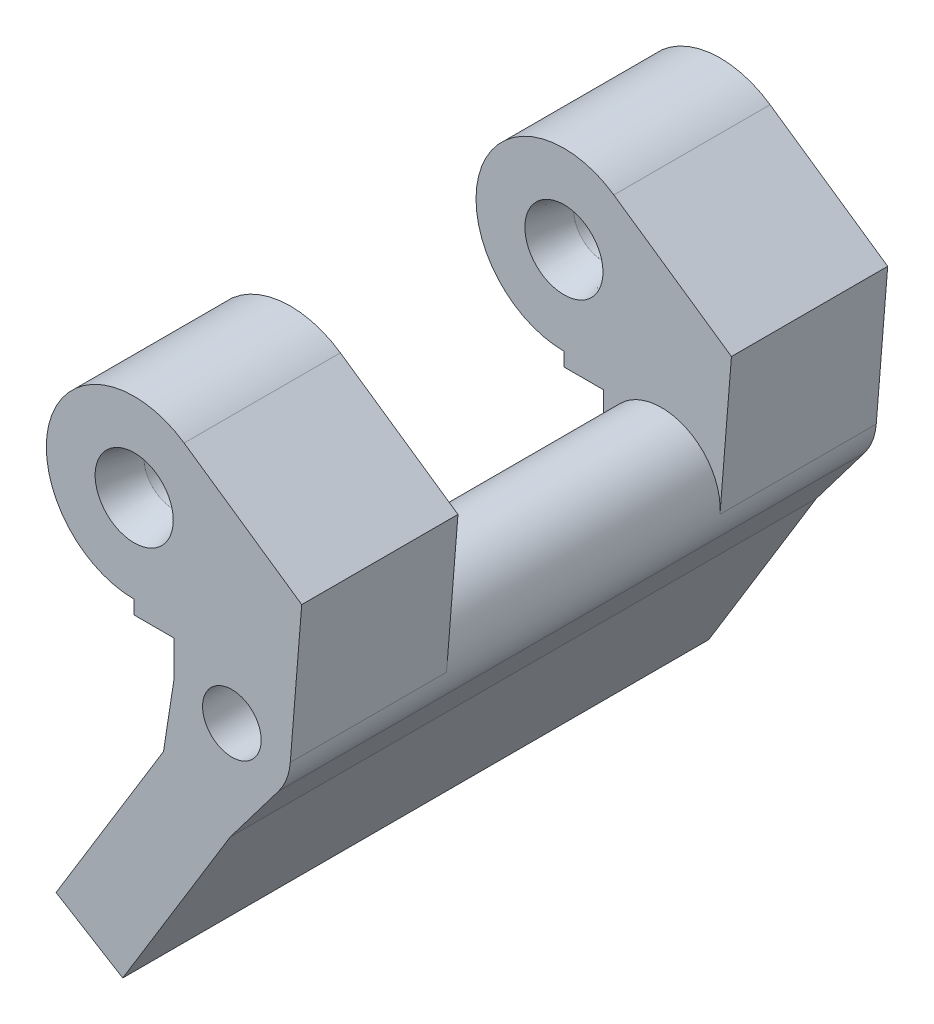
ISO-10303-21;
HEADER;
FILE_DESCRIPTION(('STEP AP214'),'2;1');
FILE_NAME('part.step','',(''),(''),'','','');
FILE_SCHEMA(('AUTOMOTIVE_DESIGN { 1 0 10303 214 1 1 1 1 }'));
ENDSEC;
DATA;
#1=APPLICATION_CONTEXT('core data for automotive mechanical design processes');
#2=APPLICATION_PROTOCOL_DEFINITION('international standard','automotive_design',2000,#1);
#3=PRODUCT_CONTEXT('',#1,'mechanical');
#4=PRODUCT('Part','Part','',(#3));
#5=PRODUCT_RELATED_PRODUCT_CATEGORY('part','',(#4));
#6=PRODUCT_DEFINITION_FORMATION('','',#4);
#7=PRODUCT_DEFINITION_CONTEXT('part definition',#1,'design');
#8=PRODUCT_DEFINITION('design','',#6,#7);
#9=PRODUCT_DEFINITION_SHAPE('','',#8);
#10=(LENGTH_UNIT() NAMED_UNIT(*) SI_UNIT(.MILLI.,.METRE.));
#11=(NAMED_UNIT(*) PLANE_ANGLE_UNIT() SI_UNIT($,.RADIAN.));
#12=(NAMED_UNIT(*) SI_UNIT($,.STERADIAN.) SOLID_ANGLE_UNIT());
#13=UNCERTAINTY_MEASURE_WITH_UNIT(LENGTH_MEASURE(1.E-05),#10,'distance_accuracy_value','');
#14=(GEOMETRIC_REPRESENTATION_CONTEXT(3) GLOBAL_UNCERTAINTY_ASSIGNED_CONTEXT((#13)) GLOBAL_UNIT_ASSIGNED_CONTEXT((#10,
#11,#12)) REPRESENTATION_CONTEXT('',''));
#15=CARTESIAN_POINT('',(0.,0.,0.));
#16=DIRECTION('',(0.,0.,1.));
#17=DIRECTION('',(1.,0.,0.));
#18=AXIS2_PLACEMENT_3D('',#15,#16,#17);
#19=CARTESIAN_POINT('',(25.8780535911808,-15.8143660834993,-30.));
#20=DIRECTION('',(-0.853281833651959,0.521450009453975,0.));
#21=DIRECTION('',(-0.521450009453975,-0.853281833651959,0.));
#22=AXIS2_PLACEMENT_3D('',#19,#20,#21);
#23=PLANE('',#22);
#24=DIRECTION('',(-0.521450009453975,-0.853281833651959,0.));
#25=VECTOR('',#24,1.);
#26=CARTESIAN_POINT('',(25.8780535911808,-15.8143660834993,0.));
#27=LINE('',#26,#25);
#28=CARTESIAN_POINT('',(25.4131273346078,-16.5751545033459,0.));
#29=VERTEX_POINT('',#28);
#30=CARTESIAN_POINT('',(19.9131273346078,-25.5751545033459,0.));
#31=VERTEX_POINT('',#30);
#32=EDGE_CURVE('E275',#29,#31,#27,.T.);
#33=ORIENTED_EDGE('',*,*,#32,.T.);
#34=DIRECTION('',(0.,0.,1.));
#35=VECTOR('',#34,1.);
#36=CARTESIAN_POINT('',(19.9131273346078,-25.5751545033459,-30.));
#37=LINE('',#36,#35);
#38=CARTESIAN_POINT('',(19.9131273346078,-25.5751545033459,-30.));
#39=VERTEX_POINT('',#38);
#40=EDGE_CURVE('E329',#39,#31,#37,.T.);
#41=ORIENTED_EDGE('',*,*,#40,.F.);
#42=DIRECTION('',(-0.521450009453975,-0.853281833651959,0.));
#43=VECTOR('',#42,1.);
#44=CARTESIAN_POINT('',(25.8780535911808,-15.8143660834993,-30.));
#45=LINE('',#44,#43);
#46=CARTESIAN_POINT('',(25.4131273346078,-16.5751545033459,-30.));
#47=VERTEX_POINT('',#46);
#48=EDGE_CURVE('E289',#47,#39,#45,.T.);
#49=ORIENTED_EDGE('',*,*,#48,.F.);
#50=DIRECTION('',(0.,0.,1.));
#51=VECTOR('',#50,1.);
#52=CARTESIAN_POINT('',(25.4131273346078,-16.5751545033459,-30.));
#53=LINE('',#52,#51);
#54=EDGE_CURVE('E309',#47,#29,#53,.T.);
#55=ORIENTED_EDGE('',*,*,#54,.T.);
#56=EDGE_LOOP('',(#33,#41,#49,#55));
#57=FACE_BOUND('',#56,.T.);
#58=ADVANCED_FACE('F45',(#57),#23,.F.);
#59=CARTESIAN_POINT('',(-5.96492625657291,-9.76078841984659,-30.));
#60=DIRECTION('',(-0.521450009453975,-0.853281833651959,0.));
#61=DIRECTION('',(0.853281833651959,-0.521450009453975,0.));
#62=AXIS2_PLACEMENT_3D('',#59,#60,#61);
#63=PLANE('',#62);
#64=DIRECTION('',(0.853281833651959,-0.521450009453975,0.));
#65=VECTOR('',#64,1.);
#66=CARTESIAN_POINT('',(-5.96492625657291,-9.76078841984659,0.));
#67=LINE('',#66,#65);
#68=CARTESIAN_POINT('',(16.5,-23.48935446553,0.));
#69=VERTEX_POINT('',#68);
#70=EDGE_CURVE('E324',#69,#31,#67,.T.);
#71=ORIENTED_EDGE('',*,*,#70,.F.);
#72=DIRECTION('',(0.,0.,1.));
#73=VECTOR('',#72,1.);
#74=CARTESIAN_POINT('',(16.5,-23.48935446553,-30.));
#75=LINE('',#74,#73);
#76=CARTESIAN_POINT('',(16.5,-23.48935446553,-30.));
#77=VERTEX_POINT('',#76);
#78=EDGE_CURVE('E332',#77,#69,#75,.T.);
#79=ORIENTED_EDGE('',*,*,#78,.F.);
#80=DIRECTION('',(0.853281833651959,-0.521450009453975,0.));
#81=VECTOR('',#80,1.);
#82=CARTESIAN_POINT('',(-5.96492625657291,-9.76078841984659,-30.));
#83=LINE('',#82,#81);
#84=EDGE_CURVE('E303',#77,#39,#83,.T.);
#85=ORIENTED_EDGE('',*,*,#84,.T.);
#86=ORIENTED_EDGE('',*,*,#40,.T.);
#87=EDGE_LOOP('',(#71,#79,#85,#86));
#88=FACE_BOUND('',#87,.T.);
#89=ADVANCED_FACE('F373',(#88),#63,.T.);
#90=CARTESIAN_POINT('',(22.4649262565729,-13.7285660456834,-30.));
#91=DIRECTION('',(-0.853281833651959,0.521450009453975,0.));
#92=DIRECTION('',(-0.521450009453975,-0.853281833651959,0.));
#93=AXIS2_PLACEMENT_3D('',#90,#91,#92);
#94=PLANE('',#93);
#95=DIRECTION('',(-0.521450009453975,-0.853281833651959,0.));
#96=VECTOR('',#95,1.);
#97=CARTESIAN_POINT('',(22.4649262565729,-13.7285660456834,0.));
#98=LINE('',#97,#96);
#99=CARTESIAN_POINT('',(22.,-14.48935446553,0.));
#100=VERTEX_POINT('',#99);
#101=EDGE_CURVE('E321',#100,#69,#98,.T.);
#102=ORIENTED_EDGE('',*,*,#101,.F.);
#103=DIRECTION('',(0.,0.,1.));
#104=VECTOR('',#103,1.);
#105=CARTESIAN_POINT('',(22.,-14.48935446553,-30.));
#106=LINE('',#105,#104);
#107=CARTESIAN_POINT('',(22.,-14.48935446553,-30.));
#108=VERTEX_POINT('',#107);
#109=EDGE_CURVE('E334',#108,#100,#106,.T.);
#110=ORIENTED_EDGE('',*,*,#109,.F.);
#111=DIRECTION('',(-0.521450009453975,-0.853281833651959,0.));
#112=VECTOR('',#111,1.);
#113=CARTESIAN_POINT('',(22.4649262565729,-13.7285660456834,-30.));
#114=LINE('',#113,#112);
#115=EDGE_CURVE('E300',#108,#77,#114,.T.);
#116=ORIENTED_EDGE('',*,*,#115,.T.);
#117=ORIENTED_EDGE('',*,*,#78,.T.);
#118=EDGE_LOOP('',(#102,#110,#116,#117));
#119=FACE_BOUND('',#118,.T.);
#120=ADVANCED_FACE('F379',(#119),#94,.T.);
#121=CARTESIAN_POINT('',(23.6753460313299,-3.66404164770582,-30.));
#122=DIRECTION('',(-0.988235294117647,0.152941176470588,0.));
#123=DIRECTION('',(-0.152941176470588,-0.988235294117647,0.));
#124=AXIS2_PLACEMENT_3D('',#121,#122,#123);
#125=PLANE('',#124);
#126=DIRECTION('',(-0.152941176470588,-0.988235294117647,0.));
#127=VECTOR('',#126,1.);
#128=CARTESIAN_POINT('',(23.6753460313299,-3.66404164770582,0.));
#129=LINE('',#128,#127);
#130=CARTESIAN_POINT('',(22.5352941176471,-11.0305309361183,0.));
#131=VERTEX_POINT('',#130);
#132=EDGE_CURVE('E318',#131,#100,#129,.T.);
#133=ORIENTED_EDGE('',*,*,#132,.F.);
#134=DIRECTION('',(0.,0.,1.));
#135=VECTOR('',#134,1.);
#136=CARTESIAN_POINT('',(22.5352941176471,-11.0305309361183,-8.));
#137=LINE('',#136,#135);
#138=CARTESIAN_POINT('',(22.5352941176471,-11.0305309361183,-8.));
#139=VERTEX_POINT('',#138);
#140=EDGE_CURVE('E279',#139,#131,#137,.T.);
#141=ORIENTED_EDGE('',*,*,#140,.F.);
#142=DIRECTION('',(0.,0.,1.));
#143=VECTOR('',#142,1.);
#144=CARTESIAN_POINT('',(22.5352941176471,-11.0305309361183,-30.));
#145=LINE('',#144,#143);
#146=CARTESIAN_POINT('',(22.5352941176471,-11.0305309361183,-22.));
#147=VERTEX_POINT('',#146);
#148=EDGE_CURVE('E339',#147,#139,#145,.T.);
#149=ORIENTED_EDGE('',*,*,#148,.F.);
#150=CARTESIAN_POINT('',(22.5352941176471,-11.0305309361183,-30.));
#151=VERTEX_POINT('',#150);
#152=EDGE_CURVE('E336',#151,#147,#145,.T.);
#153=ORIENTED_EDGE('',*,*,#152,.F.);
#154=DIRECTION('',(-0.152941176470588,-0.988235294117647,0.));
#155=VECTOR('',#154,1.);
#156=CARTESIAN_POINT('',(23.6753460313299,-3.66404164770582,-30.));
#157=LINE('',#156,#155);
#158=EDGE_CURVE('E297',#151,#108,#157,.T.);
#159=ORIENTED_EDGE('',*,*,#158,.T.);
#160=ORIENTED_EDGE('',*,*,#109,.T.);
#161=EDGE_LOOP('',(#133,#141,#149,#153,#159,#160));
#162=FACE_BOUND('',#161,.T.);
#163=ADVANCED_FACE('F458',(#162),#125,.T.);
#164=CARTESIAN_POINT('',(25.5,-11.48935446553,-30.));
#165=DIRECTION('',(0.,0.,1.));
#166=DIRECTION('',(1.,0.,0.));
#167=AXIS2_PLACEMENT_3D('',#164,#165,#166);
#168=CYLINDRICAL_SURFACE('',#167,3.);
#169=DIRECTION('',(0.,0.,1.));
#170=VECTOR('',#169,1.);
#171=CARTESIAN_POINT('',(28.490353482661,-11.7297417545805,-30.));
#172=LINE('',#171,#170);
#173=CARTESIAN_POINT('',(28.490353482661,-11.7297417545805,-30.));
#174=VERTEX_POINT('',#173);
#175=CARTESIAN_POINT('',(28.490353482661,-11.7297417545805,-22.));
#176=VERTEX_POINT('',#175);
#177=EDGE_CURVE('E61',#174,#176,#172,.T.);
#178=ORIENTED_EDGE('',*,*,#177,.T.);
#179=CARTESIAN_POINT('',(25.5,-11.48935446553,-22.));
#180=DIRECTION('',(0.,0.,1.));
#181=DIRECTION('',(1.,0.,0.));
#182=AXIS2_PLACEMENT_3D('',#179,#180,#181);
#183=CIRCLE('',#182,3.);
#184=EDGE_CURVE('E66',#176,#147,#183,.T.);
#185=ORIENTED_EDGE('',*,*,#184,.T.);
#186=ORIENTED_EDGE('',*,*,#148,.T.);
#187=CARTESIAN_POINT('',(25.5,-11.48935446553,-8.));
#188=DIRECTION('',(0.,0.,1.));
#189=DIRECTION('',(1.,0.,0.));
#190=AXIS2_PLACEMENT_3D('',#187,#188,#189);
#191=CIRCLE('',#190,3.);
#192=CARTESIAN_POINT('',(28.490353482661,-11.7297417545805,-8.));
#193=VERTEX_POINT('',#192);
#194=EDGE_CURVE('E251',#193,#139,#191,.T.);
#195=ORIENTED_EDGE('',*,*,#194,.F.);
#196=DIRECTION('',(0.,0.,1.));
#197=VECTOR('',#196,1.);
#198=CARTESIAN_POINT('',(28.490353482661,-11.7297417545805,-8.));
#199=LINE('',#198,#197);
#200=CARTESIAN_POINT('',(28.490353482661,-11.7297417545805,0.));
#201=VERTEX_POINT('',#200);
#202=EDGE_CURVE('E276',#193,#201,#199,.T.);
#203=ORIENTED_EDGE('',*,*,#202,.T.);
#204=CARTESIAN_POINT('',(25.5,-11.48935446553,0.));
#205=DIRECTION('',(0.,0.,1.));
#206=DIRECTION('',(1.,0.,0.));
#207=AXIS2_PLACEMENT_3D('',#204,#205,#206);
#208=CIRCLE('',#207,3.);
#209=CARTESIAN_POINT('',(27.8920939620198,-13.2998479001684,0.));
#210=VERTEX_POINT('',#209);
#211=EDGE_CURVE('E315',#210,#201,#208,.T.);
#212=ORIENTED_EDGE('',*,*,#211,.F.);
#213=DIRECTION('',(0.,0.,1.));
#214=VECTOR('',#213,1.);
#215=CARTESIAN_POINT('',(27.8920939620198,-13.2998479001684,-30.));
#216=LINE('',#215,#214);
#217=CARTESIAN_POINT('',(27.8920939620198,-13.2998479001684,-30.));
#218=VERTEX_POINT('',#217);
#219=EDGE_CURVE('E340',#218,#210,#216,.T.);
#220=ORIENTED_EDGE('',*,*,#219,.F.);
#221=CARTESIAN_POINT('',(25.5,-11.48935446553,-30.));
#222=DIRECTION('',(0.,0.,1.));
#223=DIRECTION('',(1.,0.,0.));
#224=AXIS2_PLACEMENT_3D('',#221,#222,#223);
#225=CIRCLE('',#224,3.);
#226=EDGE_CURVE('E295',#218,#174,#225,.T.);
#227=ORIENTED_EDGE('',*,*,#226,.T.);
#228=EDGE_LOOP('',(#178,#185,#186,#195,#203,#212,#220,#227));
#229=FACE_BOUND('',#228,.T.);
#230=ADVANCED_FACE('F461',(#229),#168,.T.);
#231=CARTESIAN_POINT('',(24.1335162022689,-18.265826231196,-30.));
#232=DIRECTION('',(0.797364654006589,-0.603497811546117,0.));
#233=DIRECTION('',(0.603497811546117,0.797364654006589,0.));
#234=AXIS2_PLACEMENT_3D('',#231,#232,#233);
#235=PLANE('',#234);
#236=DIRECTION('',(0.603497811546117,0.797364654006589,0.));
#237=VECTOR('',#236,1.);
#238=CARTESIAN_POINT('',(24.1335162022689,-18.265826231196,0.));
#239=LINE('',#238,#237);
#240=EDGE_CURVE('E312',#29,#210,#239,.T.);
#241=ORIENTED_EDGE('',*,*,#240,.F.);
#242=ORIENTED_EDGE('',*,*,#54,.F.);
#243=DIRECTION('',(0.603497811546117,0.797364654006589,0.));
#244=VECTOR('',#243,1.);
#245=CARTESIAN_POINT('',(24.1335162022689,-18.265826231196,-30.));
#246=LINE('',#245,#244);
#247=EDGE_CURVE('E291',#47,#218,#246,.T.);
#248=ORIENTED_EDGE('',*,*,#247,.T.);
#249=ORIENTED_EDGE('',*,*,#219,.T.);
#250=EDGE_LOOP('',(#241,#242,#248,#249));
#251=FACE_BOUND('',#250,.T.);
#252=ADVANCED_FACE('F384',(#251),#235,.T.);
#253=CARTESIAN_POINT('',(25.5,-11.48935446553,-30.));
#254=DIRECTION('',(0.,0.,1.));
#255=DIRECTION('',(1.,0.,0.));
#256=AXIS2_PLACEMENT_3D('',#253,#254,#255);
#257=CYLINDRICAL_SURFACE('',#256,1.5);
#258=CARTESIAN_POINT('',(25.5,-11.48935446553,-30.));
#259=DIRECTION('',(0.,0.,1.));
#260=DIRECTION('',(1.,0.,0.));
#261=AXIS2_PLACEMENT_3D('',#258,#259,#260);
#262=CIRCLE('',#261,1.5);
#263=CARTESIAN_POINT('',(27.,-11.48935446553,-30.));
#264=VERTEX_POINT('',#263);
#265=EDGE_CURVE('E306',#264,#264,#262,.T.);
#266=ORIENTED_EDGE('',*,*,#265,.F.);
#267=EDGE_LOOP('',(#266));
#268=FACE_BOUND('',#267,.T.);
#269=CARTESIAN_POINT('',(25.5,-11.48935446553,0.));
#270=DIRECTION('',(0.,0.,1.));
#271=DIRECTION('',(1.,0.,0.));
#272=AXIS2_PLACEMENT_3D('',#269,#270,#271);
#273=CIRCLE('',#272,1.5);
#274=CARTESIAN_POINT('',(27.,-11.48935446553,0.));
#275=VERTEX_POINT('',#274);
#276=EDGE_CURVE('E292',#275,#275,#273,.T.);
#277=ORIENTED_EDGE('',*,*,#276,.T.);
#278=EDGE_LOOP('',(#277));
#279=FACE_BOUND('',#278,.T.);
#280=ADVANCED_FACE('F449',(#268,#279),#257,.F.);
#281=CARTESIAN_POINT('',(0.,0.,-30.));
#282=DIRECTION('',(0.,0.,1.));
#283=DIRECTION('',(1.,0.,0.));
#284=AXIS2_PLACEMENT_3D('',#281,#282,#283);
#285=PLANE('',#284);
#286=CARTESIAN_POINT('',(20.5,-3.98935446553003,-30.));
#287=DIRECTION('',(0.,0.,1.));
#288=DIRECTION('',(1.,0.,0.));
#289=AXIS2_PLACEMENT_3D('',#286,#287,#288);
#290=CIRCLE('',#289,2.);
#291=CARTESIAN_POINT('',(22.5,-3.98935446553003,-30.));
#292=VERTEX_POINT('',#291);
#293=EDGE_CURVE('E54',#292,#292,#290,.T.);
#294=ORIENTED_EDGE('',*,*,#293,.T.);
#295=EDGE_LOOP('',(#294));
#296=FACE_BOUND('',#295,.T.);
#297=ORIENTED_EDGE('',*,*,#48,.T.);
#298=ORIENTED_EDGE('',*,*,#84,.F.);
#299=ORIENTED_EDGE('',*,*,#115,.F.);
#300=ORIENTED_EDGE('',*,*,#158,.F.);
#301=DIRECTION('',(0.,1.,0.));
#302=VECTOR('',#301,1.);
#303=CARTESIAN_POINT('',(22.535294117647,0.,-30.));
#304=LINE('',#303,#302);
#305=CARTESIAN_POINT('',(22.5352941176471,-9.18935446553003,-30.));
#306=VERTEX_POINT('',#305);
#307=EDGE_CURVE('E211',#151,#306,#304,.T.);
#308=ORIENTED_EDGE('',*,*,#307,.T.);
#309=DIRECTION('',(1.,0.,0.));
#310=VECTOR('',#309,1.);
#311=CARTESIAN_POINT('',(0.,-9.18935446553003,-30.));
#312=LINE('',#311,#310);
#313=CARTESIAN_POINT('',(20.5,-9.18935446553003,-30.));
#314=VERTEX_POINT('',#313);
#315=EDGE_CURVE('E206',#314,#306,#312,.T.);
#316=ORIENTED_EDGE('',*,*,#315,.F.);
#317=DIRECTION('',(0.,-1.,0.));
#318=VECTOR('',#317,1.);
#319=CARTESIAN_POINT('',(20.5,1.01605232164356E-13,-30.));
#320=LINE('',#319,#318);
#321=CARTESIAN_POINT('',(20.5,-8.48935446553003,-30.));
#322=VERTEX_POINT('',#321);
#323=EDGE_CURVE('E204',#322,#314,#320,.T.);
#324=ORIENTED_EDGE('',*,*,#323,.F.);
#325=CARTESIAN_POINT('',(20.5,-3.98935446553003,-30.));
#326=DIRECTION('',(0.,0.,1.));
#327=DIRECTION('',(1.,0.,0.));
#328=AXIS2_PLACEMENT_3D('',#325,#326,#327);
#329=CIRCLE('',#328,4.5);
#330=CARTESIAN_POINT('',(23.0550373605926,-0.285061808898269,-30.));
#331=VERTEX_POINT('',#330);
#332=EDGE_CURVE('E180',#331,#322,#329,.T.);
#333=ORIENTED_EDGE('',*,*,#332,.F.);
#334=DIRECTION('',(0.82317614591817,-0.567786080131689,0.));
#335=VECTOR('',#334,1.);
#336=CARTESIAN_POINT('',(7.29927229882794,10.5824835254201,-30.));
#337=LINE('',#336,#335);
#338=CARTESIAN_POINT('',(29.0764899453412,-4.43836116863591,-30.));
#339=VERTEX_POINT('',#338);
#340=EDGE_CURVE('E191',#331,#339,#337,.T.);
#341=ORIENTED_EDGE('',*,*,#340,.T.);
#342=DIRECTION('',(-0.0801290963501466,-0.996784494220345,0.));
#343=VECTOR('',#342,1.);
#344=CARTESIAN_POINT('',(29.2442976393406,-2.35087840633793,-30.));
#345=LINE('',#344,#343);
#346=EDGE_CURVE('E187',#339,#174,#345,.T.);
#347=ORIENTED_EDGE('',*,*,#346,.T.);
#348=ORIENTED_EDGE('',*,*,#226,.F.);
#349=ORIENTED_EDGE('',*,*,#247,.F.);
#350=EDGE_LOOP('',(#297,#298,#299,#300,#308,#316,#324,#333,#341,#347,#348,#349));
#351=FACE_BOUND('',#350,.T.);
#352=ORIENTED_EDGE('',*,*,#265,.T.);
#353=EDGE_LOOP('',(#352));
#354=FACE_BOUND('',#353,.T.);
#355=ADVANCED_FACE('F200',(#296,#351,#354),#285,.F.);
#356=CARTESIAN_POINT('',(0.,0.,0.));
#357=DIRECTION('',(0.,0.,1.));
#358=DIRECTION('',(1.,0.,0.));
#359=AXIS2_PLACEMENT_3D('',#356,#357,#358);
#360=PLANE('',#359);
#361=CARTESIAN_POINT('',(20.5,-3.98935446553003,0.));
#362=DIRECTION('',(0.,0.,1.));
#363=DIRECTION('',(1.,0.,0.));
#364=AXIS2_PLACEMENT_3D('',#361,#362,#363);
#365=CIRCLE('',#364,1.99999999999999);
#366=CARTESIAN_POINT('',(22.5,-3.98935446553003,0.));
#367=VERTEX_POINT('',#366);
#368=EDGE_CURVE('E351',#367,#367,#365,.F.);
#369=ORIENTED_EDGE('',*,*,#368,.T.);
#370=EDGE_LOOP('',(#369));
#371=FACE_BOUND('',#370,.T.);
#372=ORIENTED_EDGE('',*,*,#32,.F.);
#373=ORIENTED_EDGE('',*,*,#240,.T.);
#374=ORIENTED_EDGE('',*,*,#211,.T.);
#375=DIRECTION('',(-0.0801290963501466,-0.996784494220345,0.));
#376=VECTOR('',#375,1.);
#377=CARTESIAN_POINT('',(29.2442976393406,-2.35087840633793,0.));
#378=LINE('',#377,#376);
#379=CARTESIAN_POINT('',(29.0764899453412,-4.43836116863591,0.));
#380=VERTEX_POINT('',#379);
#381=EDGE_CURVE('E240',#380,#201,#378,.T.);
#382=ORIENTED_EDGE('',*,*,#381,.F.);
#383=DIRECTION('',(0.82317614591817,-0.567786080131689,0.));
#384=VECTOR('',#383,1.);
#385=CARTESIAN_POINT('',(7.29927229882794,10.5824835254201,0.));
#386=LINE('',#385,#384);
#387=CARTESIAN_POINT('',(23.0550373605926,-0.285061808898269,0.));
#388=VERTEX_POINT('',#387);
#389=EDGE_CURVE('E229',#388,#380,#386,.T.);
#390=ORIENTED_EDGE('',*,*,#389,.F.);
#391=CARTESIAN_POINT('',(20.5,-3.98935446553003,0.));
#392=DIRECTION('',(0.,0.,1.));
#393=DIRECTION('',(1.,0.,0.));
#394=AXIS2_PLACEMENT_3D('',#391,#392,#393);
#395=CIRCLE('',#394,4.5);
#396=CARTESIAN_POINT('',(20.5,-8.48935446553003,0.));
#397=VERTEX_POINT('',#396);
#398=EDGE_CURVE('E259',#388,#397,#395,.T.);
#399=ORIENTED_EDGE('',*,*,#398,.T.);
#400=DIRECTION('',(0.,-1.,0.));
#401=VECTOR('',#400,1.);
#402=CARTESIAN_POINT('',(20.5,1.01605232164356E-13,0.));
#403=LINE('',#402,#401);
#404=CARTESIAN_POINT('',(20.5,-9.18935446553003,0.));
#405=VERTEX_POINT('',#404);
#406=EDGE_CURVE('E262',#397,#405,#403,.T.);
#407=ORIENTED_EDGE('',*,*,#406,.T.);
#408=DIRECTION('',(1.,0.,0.));
#409=VECTOR('',#408,1.);
#410=CARTESIAN_POINT('',(0.,-9.18935446553003,0.));
#411=LINE('',#410,#409);
#412=CARTESIAN_POINT('',(22.5352941176471,-9.18935446553003,0.));
#413=VERTEX_POINT('',#412);
#414=EDGE_CURVE('E265',#405,#413,#411,.T.);
#415=ORIENTED_EDGE('',*,*,#414,.T.);
#416=DIRECTION('',(0.,1.,0.));
#417=VECTOR('',#416,1.);
#418=CARTESIAN_POINT('',(22.535294117647,0.,0.));
#419=LINE('',#418,#417);
#420=EDGE_CURVE('E268',#131,#413,#419,.T.);
#421=ORIENTED_EDGE('',*,*,#420,.F.);
#422=ORIENTED_EDGE('',*,*,#132,.T.);
#423=ORIENTED_EDGE('',*,*,#101,.T.);
#424=ORIENTED_EDGE('',*,*,#70,.T.);
#425=EDGE_LOOP('',(#372,#373,#374,#382,#390,#399,#407,#415,#421,#422,#423,#424));
#426=FACE_BOUND('',#425,.T.);
#427=ORIENTED_EDGE('',*,*,#276,.F.);
#428=EDGE_LOOP('',(#427));
#429=FACE_BOUND('',#428,.T.);
#430=ADVANCED_FACE('F445',(#371,#426,#429),#360,.T.);
#431=CARTESIAN_POINT('',(7.29927229882794,10.5824835254201,-8.));
#432=DIRECTION('',(-0.567786080131689,-0.82317614591817,0.));
#433=DIRECTION('',(0.82317614591817,-0.567786080131689,0.));
#434=AXIS2_PLACEMENT_3D('',#431,#432,#433);
#435=PLANE('',#434);
#436=ORIENTED_EDGE('',*,*,#389,.T.);
#437=DIRECTION('',(0.,0.,1.));
#438=VECTOR('',#437,1.);
#439=CARTESIAN_POINT('',(29.0764899453412,-4.43836116863591,-8.));
#440=LINE('',#439,#438);
#441=CARTESIAN_POINT('',(29.0764899453412,-4.43836116863591,-8.));
#442=VERTEX_POINT('',#441);
#443=EDGE_CURVE('E272',#442,#380,#440,.T.);
#444=ORIENTED_EDGE('',*,*,#443,.F.);
#445=DIRECTION('',(0.82317614591817,-0.567786080131689,0.));
#446=VECTOR('',#445,1.);
#447=CARTESIAN_POINT('',(7.29927229882794,10.5824835254201,-8.));
#448=LINE('',#447,#446);
#449=CARTESIAN_POINT('',(23.0550373605926,-0.285061808898269,-8.));
#450=VERTEX_POINT('',#449);
#451=EDGE_CURVE('E236',#450,#442,#448,.T.);
#452=ORIENTED_EDGE('',*,*,#451,.F.);
#453=DIRECTION('',(0.,0.,1.));
#454=VECTOR('',#453,1.);
#455=CARTESIAN_POINT('',(23.0550373605926,-0.285061808898269,-8.));
#456=LINE('',#455,#454);
#457=EDGE_CURVE('E256',#450,#388,#456,.T.);
#458=ORIENTED_EDGE('',*,*,#457,.T.);
#459=EDGE_LOOP('',(#436,#444,#452,#458));
#460=FACE_BOUND('',#459,.T.);
#461=ADVANCED_FACE('F431',(#460),#435,.F.);
#462=CARTESIAN_POINT('',(29.2442976393406,-2.35087840633793,-8.));
#463=DIRECTION('',(-0.996784494220345,0.0801290963501466,0.));
#464=DIRECTION('',(-0.0801290963501466,-0.996784494220345,0.));
#465=AXIS2_PLACEMENT_3D('',#462,#463,#464);
#466=PLANE('',#465);
#467=ORIENTED_EDGE('',*,*,#381,.T.);
#468=ORIENTED_EDGE('',*,*,#202,.F.);
#469=DIRECTION('',(-0.0801290963501466,-0.996784494220345,0.));
#470=VECTOR('',#469,1.);
#471=CARTESIAN_POINT('',(29.2442976393406,-2.35087840633793,-8.));
#472=LINE('',#471,#470);
#473=EDGE_CURVE('E254',#442,#193,#472,.T.);
#474=ORIENTED_EDGE('',*,*,#473,.F.);
#475=ORIENTED_EDGE('',*,*,#443,.T.);
#476=EDGE_LOOP('',(#467,#468,#474,#475));
#477=FACE_BOUND('',#476,.T.);
#478=ADVANCED_FACE('F427',(#477),#466,.F.);
#479=CARTESIAN_POINT('',(22.535294117647,0.,-8.));
#480=DIRECTION('',(1.,0.,0.));
#481=DIRECTION('',(0.,1.,0.));
#482=AXIS2_PLACEMENT_3D('',#479,#480,#481);
#483=PLANE('',#482);
#484=ORIENTED_EDGE('',*,*,#420,.T.);
#485=DIRECTION('',(0.,0.,1.));
#486=VECTOR('',#485,1.);
#487=CARTESIAN_POINT('',(22.5352941176471,-9.18935446553003,-8.));
#488=LINE('',#487,#486);
#489=CARTESIAN_POINT('',(22.5352941176471,-9.18935446553003,-8.));
#490=VERTEX_POINT('',#489);
#491=EDGE_CURVE('E282',#490,#413,#488,.T.);
#492=ORIENTED_EDGE('',*,*,#491,.F.);
#493=DIRECTION('',(0.,1.,0.));
#494=VECTOR('',#493,1.);
#495=CARTESIAN_POINT('',(22.535294117647,0.,-8.));
#496=LINE('',#495,#494);
#497=EDGE_CURVE('E249',#139,#490,#496,.T.);
#498=ORIENTED_EDGE('',*,*,#497,.F.);
#499=ORIENTED_EDGE('',*,*,#140,.T.);
#500=EDGE_LOOP('',(#484,#492,#498,#499));
#501=FACE_BOUND('',#500,.T.);
#502=ADVANCED_FACE('F430',(#501),#483,.F.);
#503=CARTESIAN_POINT('',(0.,-9.18935446553003,-8.));
#504=DIRECTION('',(0.,-1.,0.));
#505=DIRECTION('',(0.,0.,-1.));
#506=AXIS2_PLACEMENT_3D('',#503,#504,#505);
#507=PLANE('',#506);
#508=ORIENTED_EDGE('',*,*,#414,.F.);
#509=DIRECTION('',(0.,0.,1.));
#510=VECTOR('',#509,1.);
#511=CARTESIAN_POINT('',(20.5,-9.18935446553003,-8.));
#512=LINE('',#511,#510);
#513=CARTESIAN_POINT('',(20.5,-9.18935446553003,-8.));
#514=VERTEX_POINT('',#513);
#515=EDGE_CURVE('E284',#514,#405,#512,.T.);
#516=ORIENTED_EDGE('',*,*,#515,.F.);
#517=DIRECTION('',(1.,0.,0.));
#518=VECTOR('',#517,1.);
#519=CARTESIAN_POINT('',(0.,-9.18935446553003,-8.));
#520=LINE('',#519,#518);
#521=EDGE_CURVE('E246',#514,#490,#520,.T.);
#522=ORIENTED_EDGE('',*,*,#521,.T.);
#523=ORIENTED_EDGE('',*,*,#491,.T.);
#524=EDGE_LOOP('',(#508,#516,#522,#523));
#525=FACE_BOUND('',#524,.T.);
#526=ADVANCED_FACE('F435',(#525),#507,.T.);
#527=CARTESIAN_POINT('',(20.5,1.01605232164356E-13,-8.));
#528=DIRECTION('',(-1.,0.,0.));
#529=DIRECTION('',(0.,-1.,0.));
#530=AXIS2_PLACEMENT_3D('',#527,#528,#529);
#531=PLANE('',#530);
#532=ORIENTED_EDGE('',*,*,#406,.F.);
#533=DIRECTION('',(0.,0.,1.));
#534=VECTOR('',#533,1.);
#535=CARTESIAN_POINT('',(20.5,-8.48935446553003,-8.));
#536=LINE('',#535,#534);
#537=CARTESIAN_POINT('',(20.5,-8.48935446553003,-8.));
#538=VERTEX_POINT('',#537);
#539=EDGE_CURVE('E286',#538,#397,#536,.T.);
#540=ORIENTED_EDGE('',*,*,#539,.F.);
#541=DIRECTION('',(0.,-1.,0.));
#542=VECTOR('',#541,1.);
#543=CARTESIAN_POINT('',(20.5,1.01605232164356E-13,-8.));
#544=LINE('',#543,#542);
#545=EDGE_CURVE('E243',#538,#514,#544,.T.);
#546=ORIENTED_EDGE('',*,*,#545,.T.);
#547=ORIENTED_EDGE('',*,*,#515,.T.);
#548=EDGE_LOOP('',(#532,#540,#546,#547));
#549=FACE_BOUND('',#548,.T.);
#550=ADVANCED_FACE('F422',(#549),#531,.T.);
#551=CARTESIAN_POINT('',(20.5,-3.98935446553003,-8.));
#552=DIRECTION('',(0.,0.,1.));
#553=DIRECTION('',(1.,0.,0.));
#554=AXIS2_PLACEMENT_3D('',#551,#552,#553);
#555=CYLINDRICAL_SURFACE('',#554,4.5);
#556=ORIENTED_EDGE('',*,*,#398,.F.);
#557=ORIENTED_EDGE('',*,*,#457,.F.);
#558=CARTESIAN_POINT('',(20.5,-3.98935446553003,-8.));
#559=DIRECTION('',(0.,0.,1.));
#560=DIRECTION('',(1.,0.,0.));
#561=AXIS2_PLACEMENT_3D('',#558,#559,#560);
#562=CIRCLE('',#561,4.5);
#563=EDGE_CURVE('E239',#450,#538,#562,.T.);
#564=ORIENTED_EDGE('',*,*,#563,.T.);
#565=ORIENTED_EDGE('',*,*,#539,.T.);
#566=EDGE_LOOP('',(#556,#557,#564,#565));
#567=FACE_BOUND('',#566,.T.);
#568=ADVANCED_FACE('F413',(#567),#555,.T.);
#569=CARTESIAN_POINT('',(20.5,-3.98935446553003,-8.));
#570=DIRECTION('',(0.,0.,1.));
#571=DIRECTION('',(1.,0.,0.));
#572=AXIS2_PLACEMENT_3D('',#569,#570,#571);
#573=CYLINDRICAL_SURFACE('',#572,1.5);
#574=CARTESIAN_POINT('',(20.5,-3.98935446553003,-6.));
#575=DIRECTION('',(0.,0.,1.));
#576=DIRECTION('',(1.,0.,0.));
#577=AXIS2_PLACEMENT_3D('',#574,#575,#576);
#578=CIRCLE('',#577,1.5);
#579=CARTESIAN_POINT('',(22.,-3.98935446553003,-6.));
#580=VERTEX_POINT('',#579);
#581=EDGE_CURVE('E357',#580,#580,#578,.F.);
#582=ORIENTED_EDGE('',*,*,#581,.T.);
#583=EDGE_LOOP('',(#582));
#584=FACE_BOUND('',#583,.T.);
#585=CARTESIAN_POINT('',(20.5,-3.98935446553003,-2.));
#586=DIRECTION('',(0.,0.,1.));
#587=DIRECTION('',(1.,0.,0.));
#588=AXIS2_PLACEMENT_3D('',#585,#586,#587);
#589=CIRCLE('',#588,1.5);
#590=CARTESIAN_POINT('',(22.,-3.98935446553003,-2.));
#591=VERTEX_POINT('',#590);
#592=EDGE_CURVE('E348',#591,#591,#589,.T.);
#593=ORIENTED_EDGE('',*,*,#592,.T.);
#594=EDGE_LOOP('',(#593));
#595=FACE_BOUND('',#594,.T.);
#596=ADVANCED_FACE('F410',(#584,#595),#573,.F.);
#597=CARTESIAN_POINT('',(0.,0.,-8.));
#598=DIRECTION('',(0.,0.,1.));
#599=DIRECTION('',(1.,0.,0.));
#600=AXIS2_PLACEMENT_3D('',#597,#598,#599);
#601=PLANE('',#600);
#602=CARTESIAN_POINT('',(20.5,-3.98935446553003,-8.));
#603=DIRECTION('',(0.,0.,1.));
#604=DIRECTION('',(1.,0.,0.));
#605=AXIS2_PLACEMENT_3D('',#602,#603,#604);
#606=CIRCLE('',#605,2.);
#607=CARTESIAN_POINT('',(22.5,-3.98935446553003,-8.));
#608=VERTEX_POINT('',#607);
#609=EDGE_CURVE('E354',#608,#608,#606,.T.);
#610=ORIENTED_EDGE('',*,*,#609,.T.);
#611=EDGE_LOOP('',(#610));
#612=FACE_BOUND('',#611,.T.);
#613=ORIENTED_EDGE('',*,*,#451,.T.);
#614=ORIENTED_EDGE('',*,*,#473,.T.);
#615=ORIENTED_EDGE('',*,*,#194,.T.);
#616=ORIENTED_EDGE('',*,*,#497,.T.);
#617=ORIENTED_EDGE('',*,*,#521,.F.);
#618=ORIENTED_EDGE('',*,*,#545,.F.);
#619=ORIENTED_EDGE('',*,*,#563,.F.);
#620=EDGE_LOOP('',(#613,#614,#615,#616,#617,#618,#619));
#621=FACE_BOUND('',#620,.T.);
#622=ADVANCED_FACE('F412',(#612,#621),#601,.F.);
#623=CARTESIAN_POINT('',(7.29927229882794,10.5824835254201,-30.));
#624=DIRECTION('',(-0.567786080131689,-0.82317614591817,0.));
#625=DIRECTION('',(0.82317614591817,-0.567786080131689,0.));
#626=AXIS2_PLACEMENT_3D('',#623,#624,#625);
#627=PLANE('',#626);
#628=DIRECTION('',(0.82317614591817,-0.567786080131689,0.));
#629=VECTOR('',#628,1.);
#630=CARTESIAN_POINT('',(7.29927229882794,10.5824835254201,-22.));
#631=LINE('',#630,#629);
#632=CARTESIAN_POINT('',(23.0550373605926,-0.285061808898269,-22.));
#633=VERTEX_POINT('',#632);
#634=CARTESIAN_POINT('',(29.0764899453412,-4.43836116863591,-22.));
#635=VERTEX_POINT('',#634);
#636=EDGE_CURVE('E214',#633,#635,#631,.T.);
#637=ORIENTED_EDGE('',*,*,#636,.T.);
#638=DIRECTION('',(0.,0.,1.));
#639=VECTOR('',#638,1.);
#640=CARTESIAN_POINT('',(29.0764899453412,-4.43836116863591,-30.));
#641=LINE('',#640,#639);
#642=EDGE_CURVE('E194',#339,#635,#641,.T.);
#643=ORIENTED_EDGE('',*,*,#642,.F.);
#644=ORIENTED_EDGE('',*,*,#340,.F.);
#645=DIRECTION('',(0.,0.,1.));
#646=VECTOR('',#645,1.);
#647=CARTESIAN_POINT('',(23.0550373605926,-0.285061808898269,-30.));
#648=LINE('',#647,#646);
#649=EDGE_CURVE('E176',#331,#633,#648,.T.);
#650=ORIENTED_EDGE('',*,*,#649,.T.);
#651=EDGE_LOOP('',(#637,#643,#644,#650));
#652=FACE_BOUND('',#651,.T.);
#653=ADVANCED_FACE('F192',(#652),#627,.F.);
#654=CARTESIAN_POINT('',(29.2442976393406,-2.35087840633793,-30.));
#655=DIRECTION('',(-0.996784494220345,0.0801290963501466,0.));
#656=DIRECTION('',(-0.0801290963501466,-0.996784494220345,0.));
#657=AXIS2_PLACEMENT_3D('',#654,#655,#656);
#658=PLANE('',#657);
#659=DIRECTION('',(-0.0801290963501466,-0.996784494220345,0.));
#660=VECTOR('',#659,1.);
#661=CARTESIAN_POINT('',(29.2442976393406,-2.35087840633793,-22.));
#662=LINE('',#661,#660);
#663=EDGE_CURVE('E197',#635,#176,#662,.T.);
#664=ORIENTED_EDGE('',*,*,#663,.T.);
#665=ORIENTED_EDGE('',*,*,#177,.F.);
#666=ORIENTED_EDGE('',*,*,#346,.F.);
#667=ORIENTED_EDGE('',*,*,#642,.T.);
#668=EDGE_LOOP('',(#664,#665,#666,#667));
#669=FACE_BOUND('',#668,.T.);
#670=ADVANCED_FACE('F511',(#669),#658,.F.);
#671=CARTESIAN_POINT('',(22.535294117647,0.,-30.));
#672=DIRECTION('',(1.,0.,0.));
#673=DIRECTION('',(0.,1.,0.));
#674=AXIS2_PLACEMENT_3D('',#671,#672,#673);
#675=PLANE('',#674);
#676=DIRECTION('',(0.,1.,0.));
#677=VECTOR('',#676,1.);
#678=CARTESIAN_POINT('',(22.535294117647,0.,-22.));
#679=LINE('',#678,#677);
#680=CARTESIAN_POINT('',(22.5352941176471,-9.18935446553003,-22.));
#681=VERTEX_POINT('',#680);
#682=EDGE_CURVE('E223',#147,#681,#679,.T.);
#683=ORIENTED_EDGE('',*,*,#682,.T.);
#684=DIRECTION('',(0.,0.,1.));
#685=VECTOR('',#684,1.);
#686=CARTESIAN_POINT('',(22.5352941176471,-9.18935446553003,-30.));
#687=LINE('',#686,#685);
#688=EDGE_CURVE('E231',#306,#681,#687,.T.);
#689=ORIENTED_EDGE('',*,*,#688,.F.);
#690=ORIENTED_EDGE('',*,*,#307,.F.);
#691=ORIENTED_EDGE('',*,*,#152,.T.);
#692=EDGE_LOOP('',(#683,#689,#690,#691));
#693=FACE_BOUND('',#692,.T.);
#694=ADVANCED_FACE('F503',(#693),#675,.F.);
#695=CARTESIAN_POINT('',(0.,-9.18935446553003,-30.));
#696=DIRECTION('',(0.,-1.,0.));
#697=DIRECTION('',(0.,0.,-1.));
#698=AXIS2_PLACEMENT_3D('',#695,#696,#697);
#699=PLANE('',#698);
#700=DIRECTION('',(1.,0.,0.));
#701=VECTOR('',#700,1.);
#702=CARTESIAN_POINT('',(0.,-9.18935446553003,-22.));
#703=LINE('',#702,#701);
#704=CARTESIAN_POINT('',(20.5,-9.18935446553003,-22.));
#705=VERTEX_POINT('',#704);
#706=EDGE_CURVE('E220',#705,#681,#703,.T.);
#707=ORIENTED_EDGE('',*,*,#706,.F.);
#708=DIRECTION('',(0.,0.,1.));
#709=VECTOR('',#708,1.);
#710=CARTESIAN_POINT('',(20.5,-9.18935446553003,-30.));
#711=LINE('',#710,#709);
#712=EDGE_CURVE('E233',#314,#705,#711,.T.);
#713=ORIENTED_EDGE('',*,*,#712,.F.);
#714=ORIENTED_EDGE('',*,*,#315,.T.);
#715=ORIENTED_EDGE('',*,*,#688,.T.);
#716=EDGE_LOOP('',(#707,#713,#714,#715));
#717=FACE_BOUND('',#716,.T.);
#718=ADVANCED_FACE('F518',(#717),#699,.T.);
#719=CARTESIAN_POINT('',(20.5,1.01605232164356E-13,-30.));
#720=DIRECTION('',(-1.,0.,0.));
#721=DIRECTION('',(0.,-1.,0.));
#722=AXIS2_PLACEMENT_3D('',#719,#720,#721);
#723=PLANE('',#722);
#724=DIRECTION('',(0.,-1.,0.));
#725=VECTOR('',#724,1.);
#726=CARTESIAN_POINT('',(20.5,1.01605232164356E-13,-22.));
#727=LINE('',#726,#725);
#728=CARTESIAN_POINT('',(20.5,-8.48935446553003,-22.));
#729=VERTEX_POINT('',#728);
#730=EDGE_CURVE('E217',#729,#705,#727,.T.);
#731=ORIENTED_EDGE('',*,*,#730,.F.);
#732=DIRECTION('',(0.,0.,1.));
#733=VECTOR('',#732,1.);
#734=CARTESIAN_POINT('',(20.5,-8.48935446553003,-30.));
#735=LINE('',#734,#733);
#736=EDGE_CURVE('E186',#322,#729,#735,.T.);
#737=ORIENTED_EDGE('',*,*,#736,.F.);
#738=ORIENTED_EDGE('',*,*,#323,.T.);
#739=ORIENTED_EDGE('',*,*,#712,.T.);
#740=EDGE_LOOP('',(#731,#737,#738,#739));
#741=FACE_BOUND('',#740,.T.);
#742=ADVANCED_FACE('F507',(#741),#723,.T.);
#743=CARTESIAN_POINT('',(20.5,-3.98935446553003,-30.));
#744=DIRECTION('',(0.,0.,1.));
#745=DIRECTION('',(1.,0.,0.));
#746=AXIS2_PLACEMENT_3D('',#743,#744,#745);
#747=CYLINDRICAL_SURFACE('',#746,4.5);
#748=CARTESIAN_POINT('',(20.5,-3.98935446553003,-22.));
#749=DIRECTION('',(0.,0.,1.));
#750=DIRECTION('',(1.,0.,0.));
#751=AXIS2_PLACEMENT_3D('',#748,#749,#750);
#752=CIRCLE('',#751,4.5);
#753=EDGE_CURVE('E182',#633,#729,#752,.T.);
#754=ORIENTED_EDGE('',*,*,#753,.F.);
#755=ORIENTED_EDGE('',*,*,#649,.F.);
#756=ORIENTED_EDGE('',*,*,#332,.T.);
#757=ORIENTED_EDGE('',*,*,#736,.T.);
#758=EDGE_LOOP('',(#754,#755,#756,#757));
#759=FACE_BOUND('',#758,.T.);
#760=ADVANCED_FACE('F178',(#759),#747,.T.);
#761=CARTESIAN_POINT('',(20.5,-3.98935446553003,-30.));
#762=DIRECTION('',(0.,0.,1.));
#763=DIRECTION('',(1.,0.,0.));
#764=AXIS2_PLACEMENT_3D('',#761,#762,#763);
#765=CYLINDRICAL_SURFACE('',#764,1.5);
#766=CARTESIAN_POINT('',(20.5,-3.98935446553003,-28.));
#767=DIRECTION('',(0.,0.,1.));
#768=DIRECTION('',(1.,0.,0.));
#769=AXIS2_PLACEMENT_3D('',#766,#767,#768);
#770=CIRCLE('',#769,1.5);
#771=CARTESIAN_POINT('',(22.,-3.98935446553003,-28.));
#772=VERTEX_POINT('',#771);
#773=EDGE_CURVE('E11',#772,#772,#770,.F.);
#774=ORIENTED_EDGE('',*,*,#773,.T.);
#775=EDGE_LOOP('',(#774));
#776=FACE_BOUND('',#775,.T.);
#777=CARTESIAN_POINT('',(20.5,-3.98935446553003,-24.));
#778=DIRECTION('',(0.,0.,1.));
#779=DIRECTION('',(1.,0.,0.));
#780=AXIS2_PLACEMENT_3D('',#777,#778,#779);
#781=CIRCLE('',#780,1.5);
#782=CARTESIAN_POINT('',(22.,-3.98935446553003,-24.));
#783=VERTEX_POINT('',#782);
#784=EDGE_CURVE('E331',#783,#783,#781,.T.);
#785=ORIENTED_EDGE('',*,*,#784,.T.);
#786=EDGE_LOOP('',(#785));
#787=FACE_BOUND('',#786,.T.);
#788=ADVANCED_FACE('F521',(#776,#787),#765,.F.);
#789=CARTESIAN_POINT('',(0.,0.,-22.));
#790=DIRECTION('',(0.,0.,1.));
#791=DIRECTION('',(1.,0.,0.));
#792=AXIS2_PLACEMENT_3D('',#789,#790,#791);
#793=PLANE('',#792);
#794=CARTESIAN_POINT('',(20.5,-3.98935446553003,-22.));
#795=DIRECTION('',(0.,0.,1.));
#796=DIRECTION('',(1.,0.,0.));
#797=AXIS2_PLACEMENT_3D('',#794,#795,#796);
#798=CIRCLE('',#797,1.99999999999999);
#799=CARTESIAN_POINT('',(22.5,-3.98935446553003,-22.));
#800=VERTEX_POINT('',#799);
#801=EDGE_CURVE('E345',#800,#800,#798,.F.);
#802=ORIENTED_EDGE('',*,*,#801,.T.);
#803=EDGE_LOOP('',(#802));
#804=FACE_BOUND('',#803,.T.);
#805=ORIENTED_EDGE('',*,*,#636,.F.);
#806=ORIENTED_EDGE('',*,*,#753,.T.);
#807=ORIENTED_EDGE('',*,*,#730,.T.);
#808=ORIENTED_EDGE('',*,*,#706,.T.);
#809=ORIENTED_EDGE('',*,*,#682,.F.);
#810=ORIENTED_EDGE('',*,*,#184,.F.);
#811=ORIENTED_EDGE('',*,*,#663,.F.);
#812=EDGE_LOOP('',(#805,#806,#807,#808,#809,#810,#811));
#813=FACE_BOUND('',#812,.T.);
#814=ADVANCED_FACE('F393',(#804,#813),#793,.T.);
#815=CARTESIAN_POINT('',(20.5,-3.98935446553003,-24.));
#816=DIRECTION('',(0.,0.,1.));
#817=DIRECTION('',(1.,0.,0.));
#818=AXIS2_PLACEMENT_3D('',#815,#816,#817);
#819=CONICAL_SURFACE('',#818,1.5,0.244978663126859);
#820=ORIENTED_EDGE('',*,*,#801,.F.);
#821=EDGE_LOOP('',(#820));
#822=FACE_BOUND('',#821,.T.);
#823=ORIENTED_EDGE('',*,*,#784,.F.);
#824=EDGE_LOOP('',(#823));
#825=FACE_BOUND('',#824,.T.);
#826=ADVANCED_FACE('F387',(#822,#825),#819,.F.);
#827=CARTESIAN_POINT('',(20.5,-3.98935446553003,-2.));
#828=DIRECTION('',(0.,0.,1.));
#829=DIRECTION('',(1.,0.,0.));
#830=AXIS2_PLACEMENT_3D('',#827,#828,#829);
#831=CONICAL_SURFACE('',#830,1.5,0.24497866312686);
#832=ORIENTED_EDGE('',*,*,#368,.F.);
#833=EDGE_LOOP('',(#832));
#834=FACE_BOUND('',#833,.T.);
#835=ORIENTED_EDGE('',*,*,#592,.F.);
#836=EDGE_LOOP('',(#835));
#837=FACE_BOUND('',#836,.T.);
#838=ADVANCED_FACE('F369',(#834,#837),#831,.F.);
#839=CARTESIAN_POINT('',(20.5,-3.98935446553003,-8.));
#840=DIRECTION('',(0.,0.,-1.));
#841=DIRECTION('',(-1.,0.,0.));
#842=AXIS2_PLACEMENT_3D('',#839,#840,#841);
#843=CONICAL_SURFACE('',#842,2.,0.244978663126861);
#844=ORIENTED_EDGE('',*,*,#581,.F.);
#845=EDGE_LOOP('',(#844));
#846=FACE_BOUND('',#845,.T.);
#847=ORIENTED_EDGE('',*,*,#609,.F.);
#848=EDGE_LOOP('',(#847));
#849=FACE_BOUND('',#848,.T.);
#850=ADVANCED_FACE('F364',(#846,#849),#843,.F.);
#851=CARTESIAN_POINT('',(20.5,-3.98935446553003,-30.));
#852=DIRECTION('',(0.,0.,-1.));
#853=DIRECTION('',(-1.,0.,0.));
#854=AXIS2_PLACEMENT_3D('',#851,#852,#853);
#855=CONICAL_SURFACE('',#854,2.,0.244978663126861);
#856=ORIENTED_EDGE('',*,*,#773,.F.);
#857=EDGE_LOOP('',(#856));
#858=FACE_BOUND('',#857,.T.);
#859=ORIENTED_EDGE('',*,*,#293,.F.);
#860=EDGE_LOOP('',(#859));
#861=FACE_BOUND('',#860,.T.);
#862=ADVANCED_FACE('F48',(#858,#861),#855,.F.);
#863=CLOSED_SHELL('',(#58,#89,#120,#163,#230,#252,#280,#355,#430,#461,#478,#502,#526,#550,#568,
#596,#622,#653,#670,#694,#718,#742,#760,#788,#814,#826,#838,#850,#862));
#864=MANIFOLD_SOLID_BREP('B2',#863);
#865=ADVANCED_BREP_SHAPE_REPRESENTATION('',(#18,#864),#14);
#866=SHAPE_DEFINITION_REPRESENTATION(#9,#865);
ENDSEC;
END-ISO-10303-21;
